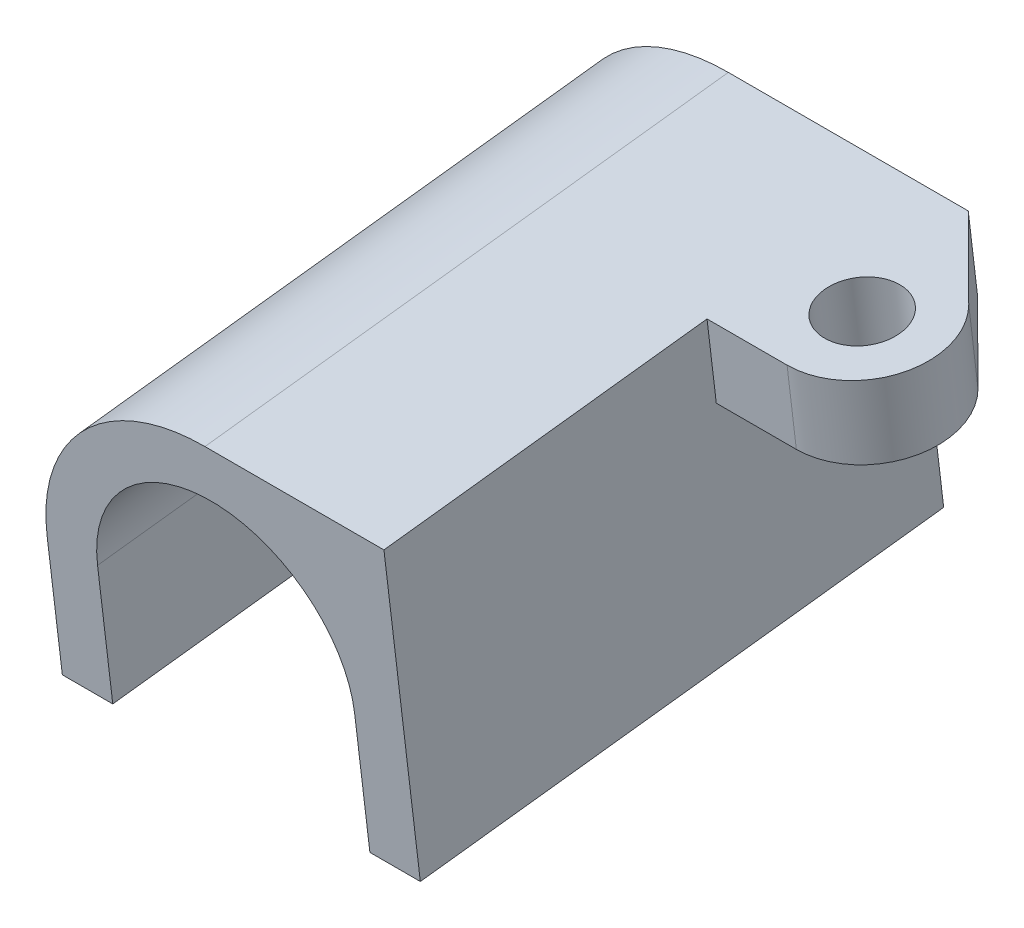
ISO-10303-21;
HEADER;
FILE_DESCRIPTION(('STEP AP214'),'2;1');
FILE_NAME('part.step','',(''),(''),'','','');
FILE_SCHEMA(('AUTOMOTIVE_DESIGN { 1 0 10303 214 1 1 1 1 }'));
ENDSEC;
DATA;
#1=APPLICATION_CONTEXT('core data for automotive mechanical design processes');
#2=APPLICATION_PROTOCOL_DEFINITION('international standard','automotive_design',2000,#1);
#3=PRODUCT_CONTEXT('',#1,'mechanical');
#4=PRODUCT('Part','Part','',(#3));
#5=PRODUCT_RELATED_PRODUCT_CATEGORY('part','',(#4));
#6=PRODUCT_DEFINITION_FORMATION('','',#4);
#7=PRODUCT_DEFINITION_CONTEXT('part definition',#1,'design');
#8=PRODUCT_DEFINITION('design','',#6,#7);
#9=PRODUCT_DEFINITION_SHAPE('','',#8);
#10=(LENGTH_UNIT() NAMED_UNIT(*) SI_UNIT(.MILLI.,.METRE.));
#11=(NAMED_UNIT(*) PLANE_ANGLE_UNIT() SI_UNIT($,.RADIAN.));
#12=(NAMED_UNIT(*) SI_UNIT($,.STERADIAN.) SOLID_ANGLE_UNIT());
#13=UNCERTAINTY_MEASURE_WITH_UNIT(LENGTH_MEASURE(1.E-05),#10,'distance_accuracy_value','');
#14=(GEOMETRIC_REPRESENTATION_CONTEXT(3) GLOBAL_UNCERTAINTY_ASSIGNED_CONTEXT((#13)) GLOBAL_UNIT_ASSIGNED_CONTEXT((#10,
#11,#12)) REPRESENTATION_CONTEXT('',''));
#15=CARTESIAN_POINT('',(0.,0.,0.));
#16=DIRECTION('',(0.,0.,1.));
#17=DIRECTION('',(1.,0.,0.));
#18=AXIS2_PLACEMENT_3D('',#15,#16,#17);
#19=CARTESIAN_POINT('',(12.5629711353436,-46.2017036641633,-99.4140959456853));
#20=DIRECTION('',(1.,0.,0.));
#21=DIRECTION('',(0.,1.,0.));
#22=AXIS2_PLACEMENT_3D('',#19,#20,#21);
#23=PLANE('',#22);
#24=DIRECTION('',(0.,0.992978694164006,0.118293334285354));
#25=VECTOR('',#24,1.);
#26=CARTESIAN_POINT('',(12.5629711353436,-46.438290332734,-97.4281385573573));
#27=LINE('',#26,#25);
#28=CARTESIAN_POINT('',(12.5629711353436,-46.438290332734,-97.4281385573573));
#29=VERTEX_POINT('',#28);
#30=CARTESIAN_POINT('',(12.5629711353436,-41.3740989924976,-96.824842552502));
#31=VERTEX_POINT('',#30);
#32=EDGE_CURVE('E143',#29,#31,#27,.T.);
#33=ORIENTED_EDGE('',*,*,#32,.F.);
#34=DIRECTION('',(0.,-0.118293334285354,0.992978694164005));
#35=VECTOR('',#34,1.);
#36=CARTESIAN_POINT('',(12.5629711353436,-46.2017036641633,-99.4140959456853));
#37=LINE('',#36,#35);
#38=CARTESIAN_POINT('',(12.5629711353436,-48.6749049083859,-78.6535335967633));
#39=VERTEX_POINT('',#38);
#40=EDGE_CURVE('E154',#29,#39,#37,.T.);
#41=ORIENTED_EDGE('',*,*,#40,.T.);
#42=DIRECTION('',(0.,-0.992978694164006,-0.118293334285354));
#43=VECTOR('',#42,1.);
#44=CARTESIAN_POINT('',(12.5629711353436,-48.6749049083859,-78.6535335967633));
#45=LINE('',#44,#43);
#46=CARTESIAN_POINT('',(12.5629711353436,-43.6107135681495,-78.050237591908));
#47=VERTEX_POINT('',#46);
#48=EDGE_CURVE('E197',#47,#39,#45,.T.);
#49=ORIENTED_EDGE('',*,*,#48,.F.);
#50=DIRECTION('',(0.,-0.118293334285354,0.992978694164005));
#51=VECTOR('',#50,1.);
#52=CARTESIAN_POINT('',(12.5629711353436,-41.1375123239269,-98.81079994083));
#53=LINE('',#52,#51);
#54=EDGE_CURVE('E156',#31,#47,#53,.T.);
#55=ORIENTED_EDGE('',*,*,#54,.F.);
#56=EDGE_LOOP('',(#33,#41,#49,#55));
#57=FACE_BOUND('',#56,.T.);
#58=ADVANCED_FACE('F43',(#57),#23,.F.);
#59=CARTESIAN_POINT('',(7.46297113534364,-41.1375123239269,-98.81079994083));
#60=DIRECTION('',(0.,-0.118293334285354,0.992978694164005));
#61=DIRECTION('',(0.,-0.992978694164006,-0.118293334285354));
#62=AXIS2_PLACEMENT_3D('',#59,#60,#61);
#63=CYLINDRICAL_SURFACE('',#62,5.1);
#64=CARTESIAN_POINT('',(7.46297113534364,-41.3740989924976,-96.824842552502));
#65=DIRECTION('',(0.,0.118293334285354,-0.992978694164006));
#66=DIRECTION('',(0.,0.992978694164006,0.118293334285354));
#67=AXIS2_PLACEMENT_3D('',#64,#65,#66);
#68=CIRCLE('',#67,5.1);
#69=CARTESIAN_POINT('',(2.36297113534364,-41.3740989924976,-96.824842552502));
#70=VERTEX_POINT('',#69);
#71=EDGE_CURVE('E157',#31,#70,#68,.F.);
#72=ORIENTED_EDGE('',*,*,#71,.F.);
#73=ORIENTED_EDGE('',*,*,#54,.T.);
#74=CARTESIAN_POINT('',(7.46297113534364,-43.6107135681495,-78.050237591908));
#75=DIRECTION('',(0.,0.118293334285354,-0.992978694164005));
#76=DIRECTION('',(0.,0.992978694164006,0.118293334285354));
#77=AXIS2_PLACEMENT_3D('',#74,#75,#76);
#78=CIRCLE('',#77,5.1);
#79=CARTESIAN_POINT('',(2.36297113534364,-43.6107135681495,-78.050237591908));
#80=VERTEX_POINT('',#79);
#81=EDGE_CURVE('E226',#80,#47,#78,.T.);
#82=ORIENTED_EDGE('',*,*,#81,.F.);
#83=DIRECTION('',(0.,-0.118293334285354,0.992978694164005));
#84=VECTOR('',#83,1.);
#85=CARTESIAN_POINT('',(2.36297113534364,-41.1375123239269,-98.81079994083));
#86=LINE('',#85,#84);
#87=EDGE_CURVE('E167',#70,#80,#86,.T.);
#88=ORIENTED_EDGE('',*,*,#87,.F.);
#89=EDGE_LOOP('',(#72,#73,#82,#88));
#90=FACE_BOUND('',#89,.T.);
#91=ADVANCED_FACE('F229',(#90),#63,.F.);
#92=CARTESIAN_POINT('',(2.36297113534364,-41.1375123239269,-98.81079994083));
#93=DIRECTION('',(-1.,0.,0.));
#94=DIRECTION('',(0.,0.,1.));
#95=AXIS2_PLACEMENT_3D('',#92,#93,#94);
#96=PLANE('',#95);
#97=DIRECTION('',(0.,-0.992978694164006,-0.118293334285354));
#98=VECTOR('',#97,1.);
#99=CARTESIAN_POINT('',(2.36297113534364,-41.3740989924976,-96.824842552502));
#100=LINE('',#99,#98);
#101=CARTESIAN_POINT('',(2.36297113534365,-46.438290332734,-97.4281385573573));
#102=VERTEX_POINT('',#101);
#103=EDGE_CURVE('E146',#70,#102,#100,.T.);
#104=ORIENTED_EDGE('',*,*,#103,.F.);
#105=ORIENTED_EDGE('',*,*,#87,.T.);
#106=DIRECTION('',(0.,0.992978694164006,0.118293334285354));
#107=VECTOR('',#106,1.);
#108=CARTESIAN_POINT('',(2.36297113534364,-43.6107135681495,-78.050237591908));
#109=LINE('',#108,#107);
#110=CARTESIAN_POINT('',(2.36297113534364,-48.6749049083859,-78.6535335967633));
#111=VERTEX_POINT('',#110);
#112=EDGE_CURVE('E222',#111,#80,#109,.T.);
#113=ORIENTED_EDGE('',*,*,#112,.F.);
#114=DIRECTION('',(0.,-0.118293334285354,0.992978694164005));
#115=VECTOR('',#114,1.);
#116=CARTESIAN_POINT('',(2.36297113534364,-46.2017036641633,-99.4140959456853));
#117=LINE('',#116,#115);
#118=EDGE_CURVE('E216',#102,#111,#117,.T.);
#119=ORIENTED_EDGE('',*,*,#118,.F.);
#120=EDGE_LOOP('',(#104,#105,#113,#119));
#121=FACE_BOUND('',#120,.T.);
#122=ADVANCED_FACE('F221',(#121),#96,.F.);
#123=CARTESIAN_POINT('',(0.36297113534365,-37.6528414031655,-77.3404775861958));
#124=DIRECTION('',(1.,0.,0.));
#125=DIRECTION('',(0.,0.,-1.));
#126=AXIS2_PLACEMENT_3D('',#123,#124,#125);
#127=PLANE('',#126);
#128=DIRECTION('',(0.,-0.118293334285354,0.992978694164005));
#129=VECTOR('',#128,1.);
#130=CARTESIAN_POINT('',(0.362971135343643,-46.2017036641633,-99.4140959456853));
#131=LINE('',#130,#129);
#132=CARTESIAN_POINT('',(0.362971135343643,-46.2017036641633,-99.4140959456853));
#133=VERTEX_POINT('',#132);
#134=CARTESIAN_POINT('',(0.362971135343643,-48.6749049083859,-78.6535335967633));
#135=VERTEX_POINT('',#134);
#136=EDGE_CURVE('E214',#133,#135,#131,.T.);
#137=ORIENTED_EDGE('',*,*,#136,.T.);
#138=DIRECTION('',(0.,-0.992978694164005,-0.118293334285354));
#139=VECTOR('',#138,1.);
#140=CARTESIAN_POINT('',(0.36297113534365,-37.6528414031655,-77.3404775861958));
#141=LINE('',#140,#139);
#142=CARTESIAN_POINT('',(0.362971135343643,-43.6107135681495,-78.050237591908));
#143=VERTEX_POINT('',#142);
#144=EDGE_CURVE('E11',#143,#135,#141,.T.);
#145=ORIENTED_EDGE('',*,*,#144,.F.);
#146=DIRECTION('',(0.,0.118293334285354,-0.992978694164005));
#147=VECTOR('',#146,1.);
#148=CARTESIAN_POINT('',(0.362971135343643,-51.1288437823319,-14.9414988980995));
#149=LINE('',#148,#147);
#150=CARTESIAN_POINT('',(0.362971135343643,-41.1375123239269,-98.81079994083));
#151=VERTEX_POINT('',#150);
#152=EDGE_CURVE('E257',#143,#151,#149,.T.);
#153=ORIENTED_EDGE('',*,*,#152,.T.);
#154=DIRECTION('',(0.,0.992978694164006,0.118293334285353));
#155=VECTOR('',#154,1.);
#156=CARTESIAN_POINT('',(0.362971135343643,-46.2017036641633,-99.4140959456853));
#157=LINE('',#156,#155);
#158=EDGE_CURVE('E208',#133,#151,#157,.T.);
#159=ORIENTED_EDGE('',*,*,#158,.F.);
#160=EDGE_LOOP('',(#137,#145,#153,#159));
#161=FACE_BOUND('',#160,.T.);
#162=ADVANCED_FACE('F264',(#161),#127,.F.);
#163=CARTESIAN_POINT('',(17.7379711353437,-35.7711068303697,-93.1361464642978));
#164=DIRECTION('',(0.,-0.992978694164005,-0.118293334285354));
#165=DIRECTION('',(0.,0.118293334285354,-0.992978694164006));
#166=AXIS2_PLACEMENT_3D('',#163,#164,#165);
#167=CYLINDRICAL_SURFACE('',#166,3.00000000000001);
#168=CARTESIAN_POINT('',(17.7379711353437,-37.7570642186977,-93.3727331328685));
#169=DIRECTION('',(0.,0.992978694164006,0.118293334285354));
#170=DIRECTION('',(0.,0.118293334285354,-0.992978694164006));
#171=AXIS2_PLACEMENT_3D('',#168,#169,#170);
#172=CIRCLE('',#171,3.00000000000001);
#173=CARTESIAN_POINT('',(17.7379711353437,-38.1119442215537,-90.3937970503765));
#174=VERTEX_POINT('',#173);
#175=CARTESIAN_POINT('',(19.8592914789033,-37.5061261621707,-95.4791590375199));
#176=VERTEX_POINT('',#175);
#177=EDGE_CURVE('E175',#174,#176,#172,.T.);
#178=ORIENTED_EDGE('',*,*,#177,.T.);
#179=DIRECTION('',(0.,-0.992978694164005,-0.118293334285354));
#180=VECTOR('',#179,1.);
#181=CARTESIAN_POINT('',(19.8592914789033,-12.692302494456,-92.5230936604132));
#182=LINE('',#181,#180);
#183=CARTESIAN_POINT('',(19.8592914789033,-34.4278922102622,-95.1124497012353));
#184=VERTEX_POINT('',#183);
#185=EDGE_CURVE('E66',#184,#176,#182,.T.);
#186=ORIENTED_EDGE('',*,*,#185,.F.);
#187=CARTESIAN_POINT('',(17.7379711353437,-34.6788302667892,-93.0060237965839));
#188=DIRECTION('',(0.,-0.992978694164005,-0.118293334285354));
#189=DIRECTION('',(0.,0.118293334285354,-0.992978694164006));
#190=AXIS2_PLACEMENT_3D('',#187,#188,#189);
#191=CIRCLE('',#190,3.);
#192=CARTESIAN_POINT('',(17.7379711353437,-35.0337102696453,-90.0270877140919));
#193=VERTEX_POINT('',#192);
#194=EDGE_CURVE('E239',#184,#193,#191,.T.);
#195=ORIENTED_EDGE('',*,*,#194,.T.);
#196=DIRECTION('',(0.,-0.992978694164005,-0.118293334285354));
#197=VECTOR('',#196,1.);
#198=CARTESIAN_POINT('',(17.7379711353437,-36.1259868332257,-90.1572103818058));
#199=LINE('',#198,#197);
#200=EDGE_CURVE('E179',#193,#174,#199,.T.);
#201=ORIENTED_EDGE('',*,*,#200,.T.);
#202=EDGE_LOOP('',(#178,#186,#195,#201));
#203=FACE_BOUND('',#202,.T.);
#204=ADVANCED_FACE('F45',(#203),#167,.T.);
#205=CARTESIAN_POINT('',(14.5629711353436,-37.6528414031655,-77.3404775861958));
#206=DIRECTION('',(-1.,0.,0.));
#207=DIRECTION('',(0.,0.,1.));
#208=AXIS2_PLACEMENT_3D('',#205,#206,#207);
#209=PLANE('',#208);
#210=DIRECTION('',(0.,-0.992978694164006,-0.118293334285353));
#211=VECTOR('',#210,1.);
#212=CARTESIAN_POINT('',(14.5629711353436,-34.0873635953625,-97.970917267404));
#213=LINE('',#212,#211);
#214=CARTESIAN_POINT('',(14.5629711353437,-37.1655975472709,-98.3376266036886));
#215=VERTEX_POINT('',#214);
#216=CARTESIAN_POINT('',(14.5629711353437,-46.2017036641633,-99.4140959456853));
#217=VERTEX_POINT('',#216);
#218=EDGE_CURVE('E198',#215,#217,#213,.T.);
#219=ORIENTED_EDGE('',*,*,#218,.F.);
#220=DIRECTION('',(0.,0.118293334285354,-0.992978694164006));
#221=VECTOR('',#220,1.);
#222=CARTESIAN_POINT('',(14.5629711353437,-37.7570642186977,-93.3727331328685));
#223=LINE('',#222,#221);
#224=CARTESIAN_POINT('',(14.5629711353436,-38.1119442215537,-90.3937970503765));
#225=VERTEX_POINT('',#224);
#226=EDGE_CURVE('E165',#225,#215,#223,.T.);
#227=ORIENTED_EDGE('',*,*,#226,.F.);
#228=DIRECTION('',(0.,-0.992978694164005,-0.118293334285354));
#229=VECTOR('',#228,1.);
#230=CARTESIAN_POINT('',(14.5629711353436,-36.1259868332257,-90.1572103818058));
#231=LINE('',#230,#229);
#232=CARTESIAN_POINT('',(14.5629711353436,-35.0337102696453,-90.0270877140919));
#233=VERTEX_POINT('',#232);
#234=EDGE_CURVE('E182',#233,#225,#231,.T.);
#235=ORIENTED_EDGE('',*,*,#234,.F.);
#236=DIRECTION('',(0.,-0.118293334285354,0.992978694164005));
#237=VECTOR('',#236,1.);
#238=CARTESIAN_POINT('',(14.5629711353436,-34.0873635953625,-97.970917267404));
#239=LINE('',#238,#237);
#240=CARTESIAN_POINT('',(14.5629711353436,-36.5605648395851,-77.210354918482));
#241=VERTEX_POINT('',#240);
#242=EDGE_CURVE('E191',#233,#241,#239,.T.);
#243=ORIENTED_EDGE('',*,*,#242,.T.);
#244=DIRECTION('',(0.,-0.992978694164005,-0.118293334285354));
#245=VECTOR('',#244,1.);
#246=CARTESIAN_POINT('',(14.5629711353436,-37.6528414031655,-77.3404775861958));
#247=LINE('',#246,#245);
#248=CARTESIAN_POINT('',(14.5629711353437,-48.6749049083859,-78.6535335967633));
#249=VERTEX_POINT('',#248);
#250=EDGE_CURVE('E51',#241,#249,#247,.T.);
#251=ORIENTED_EDGE('',*,*,#250,.T.);
#252=DIRECTION('',(0.,-0.118293334285354,0.992978694164005));
#253=VECTOR('',#252,1.);
#254=CARTESIAN_POINT('',(14.5629711353437,-46.2017036641633,-99.4140959456853));
#255=LINE('',#254,#253);
#256=EDGE_CURVE('E163',#217,#249,#255,.T.);
#257=ORIENTED_EDGE('',*,*,#256,.F.);
#258=EDGE_LOOP('',(#219,#227,#235,#243,#251,#257));
#259=FACE_BOUND('',#258,.T.);
#260=ADVANCED_FACE('F189',(#259),#209,.F.);
#261=CARTESIAN_POINT('',(17.7379711353437,-37.7570642186977,-93.3727331328685));
#262=DIRECTION('',(0.,-0.992978694164006,-0.118293334285354));
#263=DIRECTION('',(0.,0.118293334285354,-0.992978694164006));
#264=AXIS2_PLACEMENT_3D('',#261,#262,#263);
#265=PLANE('',#264);
#266=ORIENTED_EDGE('',*,*,#226,.T.);
#267=DIRECTION('',(-1.,0.,0.));
#268=VECTOR('',#267,1.);
#269=CARTESIAN_POINT('',(16.980611822463,-37.1655975472709,-98.3376266036885));
#270=LINE('',#269,#268);
#271=CARTESIAN_POINT('',(16.980611822463,-37.1655975472709,-98.3376266036885));
#272=VERTEX_POINT('',#271);
#273=EDGE_CURVE('E249',#272,#215,#270,.T.);
#274=ORIENTED_EDGE('',*,*,#273,.F.);
#275=DIRECTION('',(-0.707106781186544,0.0836460188423413,-0.702141968217134));
#276=VECTOR('',#275,1.);
#277=CARTESIAN_POINT('',(19.8592914789033,-37.5061261621707,-95.4791590375199));
#278=LINE('',#277,#276);
#279=EDGE_CURVE('E245',#176,#272,#278,.T.);
#280=ORIENTED_EDGE('',*,*,#279,.F.);
#281=ORIENTED_EDGE('',*,*,#177,.F.);
#282=DIRECTION('',(1.,0.,0.));
#283=VECTOR('',#282,1.);
#284=CARTESIAN_POINT('',(17.7379711353437,-38.1119442215537,-90.3937970503765));
#285=LINE('',#284,#283);
#286=EDGE_CURVE('E177',#225,#174,#285,.T.);
#287=ORIENTED_EDGE('',*,*,#286,.F.);
#288=EDGE_LOOP('',(#266,#274,#280,#281,#287));
#289=FACE_BOUND('',#288,.T.);
#290=CARTESIAN_POINT('',(17.7379711353437,-37.7570642186977,-93.3727331328685));
#291=DIRECTION('',(0.,0.992978694164006,0.118293334285354));
#292=DIRECTION('',(0.,-0.118293334285354,0.992978694164006));
#293=AXIS2_PLACEMENT_3D('',#290,#291,#292);
#294=CIRCLE('',#293,1.5);
#295=CARTESIAN_POINT('',(17.7379711353437,-37.9345042201257,-91.8832650916225));
#296=VERTEX_POINT('',#295);
#297=EDGE_CURVE('E172',#296,#296,#294,.T.);
#298=ORIENTED_EDGE('',*,*,#297,.T.);
#299=EDGE_LOOP('',(#298));
#300=FACE_BOUND('',#299,.T.);
#301=ADVANCED_FACE('F279',(#289,#300),#265,.T.);
#302=CARTESIAN_POINT('',(0.36297113534365,-37.6528414031655,-77.3404775861958));
#303=DIRECTION('',(0.,0.118293334285354,-0.992978694164005));
#304=DIRECTION('',(0.,0.992978694164006,0.118293334285354));
#305=AXIS2_PLACEMENT_3D('',#302,#303,#304);
#306=PLANE('',#305);
#307=DIRECTION('',(-1.,0.,0.));
#308=VECTOR('',#307,1.);
#309=CARTESIAN_POINT('',(0.362971135343643,-36.5605648395851,-77.210354918482));
#310=LINE('',#309,#308);
#311=CARTESIAN_POINT('',(7.46297113534364,-36.5605648395851,-77.2103549184819));
#312=VERTEX_POINT('',#311);
#313=EDGE_CURVE('E199',#241,#312,#310,.T.);
#314=ORIENTED_EDGE('',*,*,#313,.T.);
#315=CARTESIAN_POINT('',(7.46297113534364,-43.6107135681495,-78.050237591908));
#316=DIRECTION('',(0.,0.118293334285354,-0.992978694164005));
#317=DIRECTION('',(0.,0.992978694164006,0.118293334285354));
#318=AXIS2_PLACEMENT_3D('',#315,#316,#317);
#319=CIRCLE('',#318,7.1);
#320=EDGE_CURVE('E252',#312,#143,#319,.F.);
#321=ORIENTED_EDGE('',*,*,#320,.T.);
#322=ORIENTED_EDGE('',*,*,#144,.T.);
#323=DIRECTION('',(1.,0.,0.));
#324=VECTOR('',#323,1.);
#325=CARTESIAN_POINT('',(2.36297113534364,-48.6749049083859,-78.6535335967633));
#326=LINE('',#325,#324);
#327=EDGE_CURVE('E203',#135,#111,#326,.T.);
#328=ORIENTED_EDGE('',*,*,#327,.T.);
#329=ORIENTED_EDGE('',*,*,#112,.T.);
#330=ORIENTED_EDGE('',*,*,#81,.T.);
#331=ORIENTED_EDGE('',*,*,#48,.T.);
#332=DIRECTION('',(1.,0.,0.));
#333=VECTOR('',#332,1.);
#334=CARTESIAN_POINT('',(14.5629711353437,-48.6749049083859,-78.6535335967633));
#335=LINE('',#334,#333);
#336=EDGE_CURVE('E162',#39,#249,#335,.T.);
#337=ORIENTED_EDGE('',*,*,#336,.T.);
#338=ORIENTED_EDGE('',*,*,#250,.F.);
#339=EDGE_LOOP('',(#314,#321,#322,#328,#329,#330,#331,#337,#338));
#340=FACE_BOUND('',#339,.T.);
#341=ADVANCED_FACE('F195',(#340),#306,.F.);
#342=CARTESIAN_POINT('',(17.7379711353437,-36.1259868332257,-90.1572103818058));
#343=DIRECTION('',(0.,0.118293334285354,-0.992978694164005));
#344=DIRECTION('',(0.,0.992978694164006,0.118293334285354));
#345=AXIS2_PLACEMENT_3D('',#342,#343,#344);
#346=PLANE('',#345);
#347=ORIENTED_EDGE('',*,*,#286,.T.);
#348=ORIENTED_EDGE('',*,*,#200,.F.);
#349=DIRECTION('',(-1.,0.,0.));
#350=VECTOR('',#349,1.);
#351=CARTESIAN_POINT('',(14.5629711353436,-35.0337102696453,-90.0270877140919));
#352=LINE('',#351,#350);
#353=EDGE_CURVE('E242',#193,#233,#352,.T.);
#354=ORIENTED_EDGE('',*,*,#353,.T.);
#355=ORIENTED_EDGE('',*,*,#234,.T.);
#356=EDGE_LOOP('',(#347,#348,#354,#355));
#357=FACE_BOUND('',#356,.T.);
#358=ADVANCED_FACE('F308',(#357),#346,.F.);
#359=CARTESIAN_POINT('',(17.7379711353437,-35.7711068303697,-93.1361464642978));
#360=DIRECTION('',(0.,-0.992978694164005,-0.118293334285354));
#361=DIRECTION('',(0.,0.118293334285354,-0.992978694164006));
#362=AXIS2_PLACEMENT_3D('',#359,#360,#361);
#363=CYLINDRICAL_SURFACE('',#362,1.5);
#364=ORIENTED_EDGE('',*,*,#297,.F.);
#365=EDGE_LOOP('',(#364));
#366=FACE_BOUND('',#365,.T.);
#367=CARTESIAN_POINT('',(17.7379711353437,-34.6788302667892,-93.0060237965839));
#368=DIRECTION('',(0.,-0.992978694164005,-0.118293334285354));
#369=DIRECTION('',(0.,0.118293334285354,-0.992978694164006));
#370=AXIS2_PLACEMENT_3D('',#367,#368,#369);
#371=CIRCLE('',#370,1.50000000000001);
#372=CARTESIAN_POINT('',(17.7379711353437,-34.5013902653612,-94.4954918378299));
#373=VERTEX_POINT('',#372);
#374=EDGE_CURVE('E231',#373,#373,#371,.T.);
#375=ORIENTED_EDGE('',*,*,#374,.F.);
#376=EDGE_LOOP('',(#375));
#377=FACE_BOUND('',#376,.T.);
#378=ADVANCED_FACE('F305',(#366,#377),#363,.F.);
#379=CARTESIAN_POINT('',(14.5629711353437,-46.2017036641633,-99.4140959456853));
#380=DIRECTION('',(0.,0.992978694164005,0.118293334285354));
#381=DIRECTION('',(0.,-0.118293334285354,0.992978694164006));
#382=AXIS2_PLACEMENT_3D('',#379,#380,#381);
#383=PLANE('',#382);
#384=ORIENTED_EDGE('',*,*,#256,.T.);
#385=ORIENTED_EDGE('',*,*,#336,.F.);
#386=ORIENTED_EDGE('',*,*,#40,.F.);
#387=DIRECTION('',(-1.,0.,0.));
#388=VECTOR('',#387,1.);
#389=CARTESIAN_POINT('',(14.5629711353437,-46.438290332734,-97.4281385573573));
#390=LINE('',#389,#388);
#391=EDGE_CURVE('E140',#29,#102,#390,.T.);
#392=ORIENTED_EDGE('',*,*,#391,.T.);
#393=ORIENTED_EDGE('',*,*,#118,.T.);
#394=ORIENTED_EDGE('',*,*,#327,.F.);
#395=ORIENTED_EDGE('',*,*,#136,.F.);
#396=DIRECTION('',(-1.,0.,0.));
#397=VECTOR('',#396,1.);
#398=CARTESIAN_POINT('',(14.5629711353437,-46.2017036641633,-99.4140959456853));
#399=LINE('',#398,#397);
#400=EDGE_CURVE('E201',#217,#133,#399,.T.);
#401=ORIENTED_EDGE('',*,*,#400,.F.);
#402=EDGE_LOOP('',(#384,#385,#386,#392,#393,#394,#395,#401));
#403=FACE_BOUND('',#402,.T.);
#404=ADVANCED_FACE('F160',(#403),#383,.F.);
#405=CARTESIAN_POINT('',(0.362971135343643,-34.0873635953625,-97.970917267404));
#406=DIRECTION('',(0.,-0.992978694164005,-0.118293334285354));
#407=DIRECTION('',(0.,0.118293334285354,-0.992978694164006));
#408=AXIS2_PLACEMENT_3D('',#405,#406,#407);
#409=PLANE('',#408);
#410=DIRECTION('',(0.707106781186544,-0.0836460188423413,0.702141968217134));
#411=VECTOR('',#410,1.);
#412=CARTESIAN_POINT('',(19.8592914789033,-34.4278922102622,-95.1124497012353));
#413=LINE('',#412,#411);
#414=CARTESIAN_POINT('',(16.980611822463,-34.0873635953625,-97.9709172674039));
#415=VERTEX_POINT('',#414);
#416=EDGE_CURVE('E237',#415,#184,#413,.T.);
#417=ORIENTED_EDGE('',*,*,#416,.F.);
#418=DIRECTION('',(1.,0.,0.));
#419=VECTOR('',#418,1.);
#420=CARTESIAN_POINT('',(0.362971135343643,-34.0873635953625,-97.970917267404));
#421=LINE('',#420,#419);
#422=CARTESIAN_POINT('',(7.46297113534364,-34.0873635953625,-97.970917267404));
#423=VERTEX_POINT('',#422);
#424=EDGE_CURVE('E211',#423,#415,#421,.T.);
#425=ORIENTED_EDGE('',*,*,#424,.F.);
#426=DIRECTION('',(0.,0.118293334285354,-0.992978694164005));
#427=VECTOR('',#426,1.);
#428=CARTESIAN_POINT('',(7.46297113534364,-44.0786950537674,-14.1016162246735));
#429=LINE('',#428,#427);
#430=EDGE_CURVE('E58',#312,#423,#429,.T.);
#431=ORIENTED_EDGE('',*,*,#430,.F.);
#432=ORIENTED_EDGE('',*,*,#313,.F.);
#433=ORIENTED_EDGE('',*,*,#242,.F.);
#434=ORIENTED_EDGE('',*,*,#353,.F.);
#435=ORIENTED_EDGE('',*,*,#194,.F.);
#436=EDGE_LOOP('',(#417,#425,#431,#432,#433,#434,#435));
#437=FACE_BOUND('',#436,.T.);
#438=ORIENTED_EDGE('',*,*,#374,.T.);
#439=EDGE_LOOP('',(#438));
#440=FACE_BOUND('',#439,.T.);
#441=ADVANCED_FACE('F273',(#437,#440),#409,.F.);
#442=CARTESIAN_POINT('',(7.46297113534364,-41.1375123239269,-98.81079994083));
#443=DIRECTION('',(0.,-0.118293334285354,0.992978694164006));
#444=DIRECTION('',(0.,-0.992978694164006,-0.118293334285354));
#445=AXIS2_PLACEMENT_3D('',#442,#443,#444);
#446=PLANE('',#445);
#447=ORIENTED_EDGE('',*,*,#273,.T.);
#448=ORIENTED_EDGE('',*,*,#218,.T.);
#449=ORIENTED_EDGE('',*,*,#400,.T.);
#450=ORIENTED_EDGE('',*,*,#158,.T.);
#451=CARTESIAN_POINT('',(7.46297113534364,-41.1375123239269,-98.81079994083));
#452=DIRECTION('',(0.,-0.118293334285354,0.992978694164006));
#453=DIRECTION('',(0.,0.992978694164006,0.118293334285354));
#454=AXIS2_PLACEMENT_3D('',#451,#452,#453);
#455=CIRCLE('',#454,7.1);
#456=EDGE_CURVE('E255',#423,#151,#455,.T.);
#457=ORIENTED_EDGE('',*,*,#456,.F.);
#458=ORIENTED_EDGE('',*,*,#424,.T.);
#459=DIRECTION('',(0.,-0.992978694164005,-0.118293334285354));
#460=VECTOR('',#459,1.);
#461=CARTESIAN_POINT('',(16.980611822463,-12.3517738795563,-95.3815612265819));
#462=LINE('',#461,#460);
#463=EDGE_CURVE('E236',#415,#272,#462,.T.);
#464=ORIENTED_EDGE('',*,*,#463,.T.);
#465=EDGE_LOOP('',(#447,#448,#449,#450,#457,#458,#464));
#466=FACE_BOUND('',#465,.T.);
#467=ADVANCED_FACE('F268',(#466),#446,.F.);
#468=CARTESIAN_POINT('',(19.8592914789033,-12.6923024944561,-92.5230936604132));
#469=DIRECTION('',(-0.707106781186551,-0.0836460188423405,0.702141968217128));
#470=DIRECTION('',(0.704611256441468,0.,0.709593529632265));
#471=AXIS2_PLACEMENT_3D('',#468,#469,#470);
#472=PLANE('',#471);
#473=ORIENTED_EDGE('',*,*,#463,.F.);
#474=ORIENTED_EDGE('',*,*,#416,.T.);
#475=ORIENTED_EDGE('',*,*,#185,.T.);
#476=ORIENTED_EDGE('',*,*,#279,.T.);
#477=EDGE_LOOP('',(#473,#474,#475,#476));
#478=FACE_BOUND('',#477,.T.);
#479=ADVANCED_FACE('F283',(#478),#472,.F.);
#480=CARTESIAN_POINT('',(7.46297113534364,-51.1288437823319,-14.9414988980995));
#481=DIRECTION('',(0.,0.118293334285354,-0.992978694164005));
#482=DIRECTION('',(0.,0.992978694164006,0.118293334285354));
#483=AXIS2_PLACEMENT_3D('',#480,#481,#482);
#484=CYLINDRICAL_SURFACE('',#483,7.1);
#485=ORIENTED_EDGE('',*,*,#456,.T.);
#486=ORIENTED_EDGE('',*,*,#152,.F.);
#487=ORIENTED_EDGE('',*,*,#320,.F.);
#488=ORIENTED_EDGE('',*,*,#430,.T.);
#489=EDGE_LOOP('',(#485,#486,#487,#488));
#490=FACE_BOUND('',#489,.T.);
#491=ADVANCED_FACE('F265',(#490),#484,.T.);
#492=CARTESIAN_POINT('',(7.46297113534364,-41.3740989924976,-96.824842552502));
#493=DIRECTION('',(0.,0.118293334285354,-0.992978694164006));
#494=DIRECTION('',(0.,0.992978694164006,0.118293334285354));
#495=AXIS2_PLACEMENT_3D('',#492,#493,#494);
#496=PLANE('',#495);
#497=ORIENTED_EDGE('',*,*,#391,.F.);
#498=ORIENTED_EDGE('',*,*,#32,.T.);
#499=ORIENTED_EDGE('',*,*,#71,.T.);
#500=ORIENTED_EDGE('',*,*,#103,.T.);
#501=EDGE_LOOP('',(#497,#498,#499,#500));
#502=FACE_BOUND('',#501,.T.);
#503=ADVANCED_FACE('F142',(#502),#496,.F.);
#504=CLOSED_SHELL('',(#58,#91,#122,#162,#204,#260,#301,#341,#358,#378,#404,#441,#467,#479,#491,#503));
#505=MANIFOLD_SOLID_BREP('B2',#504);
#506=ADVANCED_BREP_SHAPE_REPRESENTATION('',(#18,#505),#14);
#507=SHAPE_DEFINITION_REPRESENTATION(#9,#506);
ENDSEC;
END-ISO-10303-21;
